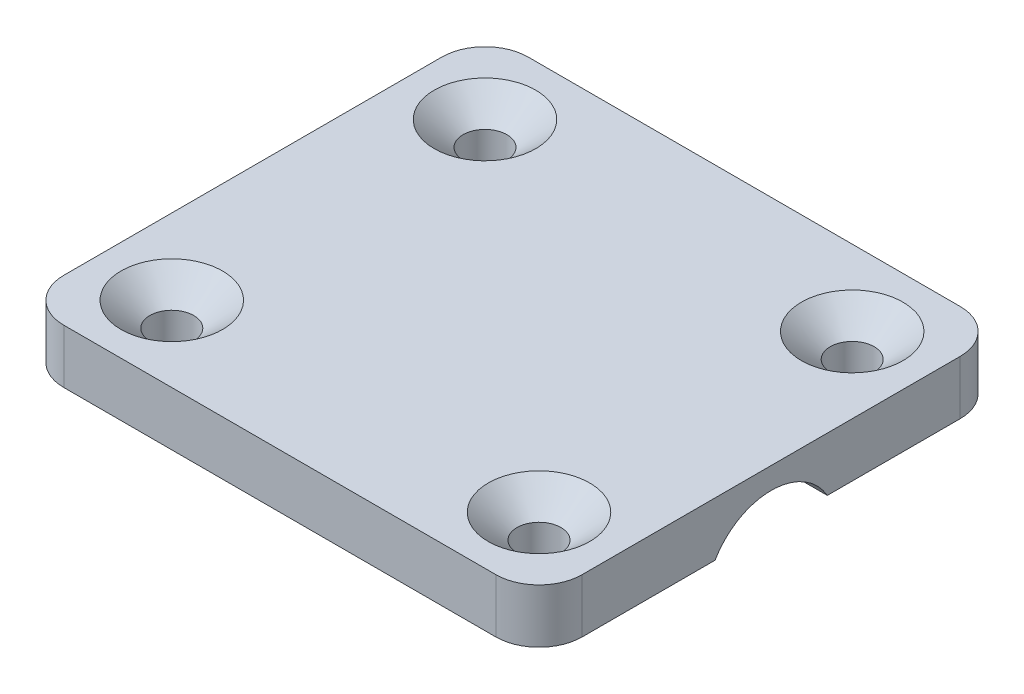
ISO-10303-21;
HEADER;
FILE_DESCRIPTION(('STEP AP214'),'2;1');
FILE_NAME('part.step','',(''),(''),'','','');
FILE_SCHEMA(('AUTOMOTIVE_DESIGN { 1 0 10303 214 1 1 1 1 }'));
ENDSEC;
DATA;
#1=APPLICATION_CONTEXT('core data for automotive mechanical design processes');
#2=APPLICATION_PROTOCOL_DEFINITION('international standard','automotive_design',2000,#1);
#3=PRODUCT_CONTEXT('',#1,'mechanical');
#4=PRODUCT('Part','Part','',(#3));
#5=PRODUCT_RELATED_PRODUCT_CATEGORY('part','',(#4));
#6=PRODUCT_DEFINITION_FORMATION('','',#4);
#7=PRODUCT_DEFINITION_CONTEXT('part definition',#1,'design');
#8=PRODUCT_DEFINITION('design','',#6,#7);
#9=PRODUCT_DEFINITION_SHAPE('','',#8);
#10=(LENGTH_UNIT() NAMED_UNIT(*) SI_UNIT(.MILLI.,.METRE.));
#11=(NAMED_UNIT(*) PLANE_ANGLE_UNIT() SI_UNIT($,.RADIAN.));
#12=(NAMED_UNIT(*) SI_UNIT($,.STERADIAN.) SOLID_ANGLE_UNIT());
#13=UNCERTAINTY_MEASURE_WITH_UNIT(LENGTH_MEASURE(1.E-05),#10,'distance_accuracy_value','');
#14=(GEOMETRIC_REPRESENTATION_CONTEXT(3) GLOBAL_UNCERTAINTY_ASSIGNED_CONTEXT((#13)) GLOBAL_UNIT_ASSIGNED_CONTEXT((#10,
#11,#12)) REPRESENTATION_CONTEXT('',''));
#15=CARTESIAN_POINT('',(0.,0.,0.));
#16=DIRECTION('',(0.,0.,1.));
#17=DIRECTION('',(1.,0.,0.));
#18=AXIS2_PLACEMENT_3D('',#15,#16,#17);
#19=CARTESIAN_POINT('',(0.,0.,0.));
#20=DIRECTION('',(0.,1.,0.));
#21=DIRECTION('',(0.,0.,1.));
#22=AXIS2_PLACEMENT_3D('',#19,#20,#21);
#23=PLANE('',#22);
#24=CARTESIAN_POINT('',(17.,0.,14.5));
#25=DIRECTION('',(0.,1.,0.));
#26=DIRECTION('',(0.,0.,1.));
#27=AXIS2_PLACEMENT_3D('',#24,#25,#26);
#28=CIRCLE('',#27,2.03199999999999);
#29=CARTESIAN_POINT('',(17.,0.,16.532));
#30=VERTEX_POINT('',#29);
#31=EDGE_CURVE('E180',#30,#30,#28,.T.);
#32=ORIENTED_EDGE('',*,*,#31,.T.);
#33=EDGE_LOOP('',(#32));
#34=FACE_BOUND('',#33,.T.);
#35=CARTESIAN_POINT('',(-17.,0.,14.5));
#36=DIRECTION('',(0.,1.,0.));
#37=DIRECTION('',(0.,0.,1.));
#38=AXIS2_PLACEMENT_3D('',#35,#36,#37);
#39=CIRCLE('',#38,2.03199999999999);
#40=CARTESIAN_POINT('',(-17.,0.,16.532));
#41=VERTEX_POINT('',#40);
#42=EDGE_CURVE('E190',#41,#41,#39,.T.);
#43=ORIENTED_EDGE('',*,*,#42,.T.);
#44=EDGE_LOOP('',(#43));
#45=FACE_BOUND('',#44,.T.);
#46=DIRECTION('',(0.,0.,1.));
#47=VECTOR('',#46,1.);
#48=CARTESIAN_POINT('',(-24.,0.,-21.5));
#49=LINE('',#48,#47);
#50=CARTESIAN_POINT('',(-24.,0.,5.19615242270664));
#51=VERTEX_POINT('',#50);
#52=CARTESIAN_POINT('',(-24.,0.,17.5));
#53=VERTEX_POINT('',#52);
#54=EDGE_CURVE('E121',#51,#53,#49,.T.);
#55=ORIENTED_EDGE('',*,*,#54,.F.);
#56=DIRECTION('',(1.,0.,0.));
#57=VECTOR('',#56,1.);
#58=CARTESIAN_POINT('',(-31.,0.,5.19615242270664));
#59=LINE('',#58,#57);
#60=CARTESIAN_POINT('',(24.,0.,5.19615242270663));
#61=VERTEX_POINT('',#60);
#62=EDGE_CURVE('E11',#51,#61,#59,.T.);
#63=ORIENTED_EDGE('',*,*,#62,.T.);
#64=DIRECTION('',(0.,0.,-1.));
#65=VECTOR('',#64,1.);
#66=CARTESIAN_POINT('',(24.,0.,-21.5));
#67=LINE('',#66,#65);
#68=CARTESIAN_POINT('',(24.,0.,17.5));
#69=VERTEX_POINT('',#68);
#70=EDGE_CURVE('E119',#69,#61,#67,.T.);
#71=ORIENTED_EDGE('',*,*,#70,.F.);
#72=CARTESIAN_POINT('',(20.,0.,17.5));
#73=DIRECTION('',(0.,1.,0.));
#74=DIRECTION('',(0.,0.,1.));
#75=AXIS2_PLACEMENT_3D('',#72,#73,#74);
#76=CIRCLE('',#75,4.);
#77=CARTESIAN_POINT('',(20.,0.,21.5));
#78=VERTEX_POINT('',#77);
#79=EDGE_CURVE('E148',#69,#78,#76,.F.);
#80=ORIENTED_EDGE('',*,*,#79,.T.);
#81=DIRECTION('',(1.,0.,0.));
#82=VECTOR('',#81,1.);
#83=CARTESIAN_POINT('',(-24.,0.,21.5));
#84=LINE('',#83,#82);
#85=CARTESIAN_POINT('',(-20.,0.,21.5));
#86=VERTEX_POINT('',#85);
#87=EDGE_CURVE('E139',#86,#78,#84,.T.);
#88=ORIENTED_EDGE('',*,*,#87,.F.);
#89=CARTESIAN_POINT('',(-20.,0.,17.5));
#90=DIRECTION('',(0.,1.,0.));
#91=DIRECTION('',(0.,0.,1.));
#92=AXIS2_PLACEMENT_3D('',#89,#90,#91);
#93=CIRCLE('',#92,4.);
#94=EDGE_CURVE('E155',#86,#53,#93,.F.);
#95=ORIENTED_EDGE('',*,*,#94,.T.);
#96=EDGE_LOOP('',(#55,#63,#71,#80,#88,#95));
#97=FACE_BOUND('',#96,.T.);
#98=ADVANCED_FACE('F33',(#34,#45,#97),#23,.F.);
#99=CARTESIAN_POINT('',(24.,5.,-21.5));
#100=DIRECTION('',(-1.,0.,0.));
#101=DIRECTION('',(0.,0.,1.));
#102=AXIS2_PLACEMENT_3D('',#99,#100,#101);
#103=PLANE('',#102);
#104=ORIENTED_EDGE('',*,*,#70,.T.);
#105=CARTESIAN_POINT('',(24.,-3.,0.));
#106=DIRECTION('',(1.,0.,0.));
#107=DIRECTION('',(0.,0.,1.));
#108=AXIS2_PLACEMENT_3D('',#105,#106,#107);
#109=CIRCLE('',#108,6.);
#110=CARTESIAN_POINT('',(24.,0.,-5.19615242270663));
#111=VERTEX_POINT('',#110);
#112=EDGE_CURVE('E110',#111,#61,#109,.T.);
#113=ORIENTED_EDGE('',*,*,#112,.F.);
#114=CARTESIAN_POINT('',(24.,0.,-17.5));
#115=VERTEX_POINT('',#114);
#116=EDGE_CURVE('E128',#111,#115,#67,.T.);
#117=ORIENTED_EDGE('',*,*,#116,.T.);
#118=DIRECTION('',(0.,-1.,0.));
#119=VECTOR('',#118,1.);
#120=CARTESIAN_POINT('',(24.,5.,-17.5));
#121=LINE('',#120,#119);
#122=CARTESIAN_POINT('',(24.,5.,-17.5));
#123=VERTEX_POINT('',#122);
#124=EDGE_CURVE('E175',#115,#123,#121,.F.);
#125=ORIENTED_EDGE('',*,*,#124,.T.);
#126=DIRECTION('',(0.,0.,-1.));
#127=VECTOR('',#126,1.);
#128=CARTESIAN_POINT('',(24.,5.,-21.5));
#129=LINE('',#128,#127);
#130=CARTESIAN_POINT('',(24.,5.,17.5));
#131=VERTEX_POINT('',#130);
#132=EDGE_CURVE('E142',#131,#123,#129,.T.);
#133=ORIENTED_EDGE('',*,*,#132,.F.);
#134=DIRECTION('',(0.,-1.,0.));
#135=VECTOR('',#134,1.);
#136=CARTESIAN_POINT('',(24.,5.,17.5));
#137=LINE('',#136,#135);
#138=EDGE_CURVE('E126',#131,#69,#137,.T.);
#139=ORIENTED_EDGE('',*,*,#138,.T.);
#140=EDGE_LOOP('',(#104,#113,#117,#125,#133,#139));
#141=FACE_BOUND('',#140,.T.);
#142=ADVANCED_FACE('F123',(#141),#103,.F.);
#143=CARTESIAN_POINT('',(-24.,5.,-21.5));
#144=DIRECTION('',(0.,0.,1.));
#145=DIRECTION('',(1.,0.,0.));
#146=AXIS2_PLACEMENT_3D('',#143,#144,#145);
#147=PLANE('',#146);
#148=DIRECTION('',(-1.,0.,0.));
#149=VECTOR('',#148,1.);
#150=CARTESIAN_POINT('',(-24.,0.,-21.5));
#151=LINE('',#150,#149);
#152=CARTESIAN_POINT('',(20.,0.,-21.5));
#153=VERTEX_POINT('',#152);
#154=CARTESIAN_POINT('',(-20.,0.,-21.5));
#155=VERTEX_POINT('',#154);
#156=EDGE_CURVE('E127',#153,#155,#151,.T.);
#157=ORIENTED_EDGE('',*,*,#156,.T.);
#158=DIRECTION('',(0.,-1.,0.));
#159=VECTOR('',#158,1.);
#160=CARTESIAN_POINT('',(-20.,5.,-21.5));
#161=LINE('',#160,#159);
#162=CARTESIAN_POINT('',(-20.,5.,-21.5));
#163=VERTEX_POINT('',#162);
#164=EDGE_CURVE('E56',#155,#163,#161,.F.);
#165=ORIENTED_EDGE('',*,*,#164,.T.);
#166=DIRECTION('',(-1.,0.,0.));
#167=VECTOR('',#166,1.);
#168=CARTESIAN_POINT('',(-24.,5.,-21.5));
#169=LINE('',#168,#167);
#170=CARTESIAN_POINT('',(20.,5.,-21.5));
#171=VERTEX_POINT('',#170);
#172=EDGE_CURVE('E209',#171,#163,#169,.T.);
#173=ORIENTED_EDGE('',*,*,#172,.F.);
#174=DIRECTION('',(0.,-1.,0.));
#175=VECTOR('',#174,1.);
#176=CARTESIAN_POINT('',(20.,5.,-21.5));
#177=LINE('',#176,#175);
#178=EDGE_CURVE('E170',#171,#153,#177,.T.);
#179=ORIENTED_EDGE('',*,*,#178,.T.);
#180=EDGE_LOOP('',(#157,#165,#173,#179));
#181=FACE_BOUND('',#180,.T.);
#182=ADVANCED_FACE('F207',(#181),#147,.F.);
#183=CARTESIAN_POINT('',(-24.,5.,-21.5));
#184=DIRECTION('',(1.,0.,0.));
#185=DIRECTION('',(0.,0.,-1.));
#186=AXIS2_PLACEMENT_3D('',#183,#184,#185);
#187=PLANE('',#186);
#188=CARTESIAN_POINT('',(-24.,0.,-17.5));
#189=VERTEX_POINT('',#188);
#190=CARTESIAN_POINT('',(-24.,0.,-5.19615242270663));
#191=VERTEX_POINT('',#190);
#192=EDGE_CURVE('E136',#189,#191,#49,.T.);
#193=ORIENTED_EDGE('',*,*,#192,.T.);
#194=CARTESIAN_POINT('',(-24.,-3.,0.));
#195=DIRECTION('',(1.,0.,0.));
#196=DIRECTION('',(0.,0.,-1.));
#197=AXIS2_PLACEMENT_3D('',#194,#195,#196);
#198=CIRCLE('',#197,6.);
#199=EDGE_CURVE('E48',#191,#51,#198,.T.);
#200=ORIENTED_EDGE('',*,*,#199,.T.);
#201=ORIENTED_EDGE('',*,*,#54,.T.);
#202=DIRECTION('',(0.,-1.,0.));
#203=VECTOR('',#202,1.);
#204=CARTESIAN_POINT('',(-24.,5.,17.5));
#205=LINE('',#204,#203);
#206=CARTESIAN_POINT('',(-24.,5.,17.5));
#207=VERTEX_POINT('',#206);
#208=EDGE_CURVE('E160',#53,#207,#205,.F.);
#209=ORIENTED_EDGE('',*,*,#208,.T.);
#210=DIRECTION('',(0.,0.,1.));
#211=VECTOR('',#210,1.);
#212=CARTESIAN_POINT('',(-24.,5.,-21.5));
#213=LINE('',#212,#211);
#214=CARTESIAN_POINT('',(-24.,5.,-17.5));
#215=VERTEX_POINT('',#214);
#216=EDGE_CURVE('E202',#215,#207,#213,.T.);
#217=ORIENTED_EDGE('',*,*,#216,.F.);
#218=DIRECTION('',(0.,-1.,0.));
#219=VECTOR('',#218,1.);
#220=CARTESIAN_POINT('',(-24.,5.,-17.5));
#221=LINE('',#220,#219);
#222=EDGE_CURVE('E157',#215,#189,#221,.T.);
#223=ORIENTED_EDGE('',*,*,#222,.T.);
#224=EDGE_LOOP('',(#193,#200,#201,#209,#217,#223));
#225=FACE_BOUND('',#224,.T.);
#226=ADVANCED_FACE('F198',(#225),#187,.F.);
#227=CARTESIAN_POINT('',(-24.,5.,21.5));
#228=DIRECTION('',(0.,0.,-1.));
#229=DIRECTION('',(-1.,0.,0.));
#230=AXIS2_PLACEMENT_3D('',#227,#228,#229);
#231=PLANE('',#230);
#232=DIRECTION('',(1.,0.,0.));
#233=VECTOR('',#232,1.);
#234=CARTESIAN_POINT('',(-24.,5.,21.5));
#235=LINE('',#234,#233);
#236=CARTESIAN_POINT('',(-20.,5.,21.5));
#237=VERTEX_POINT('',#236);
#238=CARTESIAN_POINT('',(20.,5.,21.5));
#239=VERTEX_POINT('',#238);
#240=EDGE_CURVE('E133',#237,#239,#235,.T.);
#241=ORIENTED_EDGE('',*,*,#240,.F.);
#242=DIRECTION('',(0.,-1.,0.));
#243=VECTOR('',#242,1.);
#244=CARTESIAN_POINT('',(-20.,5.,21.5));
#245=LINE('',#244,#243);
#246=EDGE_CURVE('E145',#237,#86,#245,.T.);
#247=ORIENTED_EDGE('',*,*,#246,.T.);
#248=ORIENTED_EDGE('',*,*,#87,.T.);
#249=DIRECTION('',(0.,-1.,0.));
#250=VECTOR('',#249,1.);
#251=CARTESIAN_POINT('',(20.,5.,21.5));
#252=LINE('',#251,#250);
#253=EDGE_CURVE('E143',#78,#239,#252,.F.);
#254=ORIENTED_EDGE('',*,*,#253,.T.);
#255=EDGE_LOOP('',(#241,#247,#248,#254));
#256=FACE_BOUND('',#255,.T.);
#257=ADVANCED_FACE('F230',(#256),#231,.F.);
#258=CARTESIAN_POINT('',(0.,5.,0.));
#259=DIRECTION('',(0.,1.,0.));
#260=DIRECTION('',(0.,0.,1.));
#261=AXIS2_PLACEMENT_3D('',#258,#259,#260);
#262=PLANE('',#261);
#263=CARTESIAN_POINT('',(-17.,5.,14.5));
#264=DIRECTION('',(0.,1.,0.));
#265=DIRECTION('',(0.,0.,1.));
#266=AXIS2_PLACEMENT_3D('',#263,#264,#265);
#267=CIRCLE('',#266,4.699);
#268=CARTESIAN_POINT('',(-17.,5.,19.199));
#269=VERTEX_POINT('',#268);
#270=EDGE_CURVE('E430',#269,#269,#267,.T.);
#271=ORIENTED_EDGE('',*,*,#270,.F.);
#272=EDGE_LOOP('',(#271));
#273=FACE_BOUND('',#272,.T.);
#274=CARTESIAN_POINT('',(-17.,5.,-14.5));
#275=DIRECTION('',(0.,1.,0.));
#276=DIRECTION('',(0.,0.,1.));
#277=AXIS2_PLACEMENT_3D('',#274,#275,#276);
#278=CIRCLE('',#277,4.699);
#279=CARTESIAN_POINT('',(-17.,5.,-9.801));
#280=VERTEX_POINT('',#279);
#281=EDGE_CURVE('E192',#280,#280,#278,.T.);
#282=ORIENTED_EDGE('',*,*,#281,.F.);
#283=EDGE_LOOP('',(#282));
#284=FACE_BOUND('',#283,.T.);
#285=CARTESIAN_POINT('',(17.,5.,14.5));
#286=DIRECTION('',(0.,1.,0.));
#287=DIRECTION('',(0.,0.,1.));
#288=AXIS2_PLACEMENT_3D('',#285,#286,#287);
#289=CIRCLE('',#288,4.699);
#290=CARTESIAN_POINT('',(17.,5.,19.199));
#291=VERTEX_POINT('',#290);
#292=EDGE_CURVE('E188',#291,#291,#289,.T.);
#293=ORIENTED_EDGE('',*,*,#292,.F.);
#294=EDGE_LOOP('',(#293));
#295=FACE_BOUND('',#294,.T.);
#296=CARTESIAN_POINT('',(17.,5.,-14.5));
#297=DIRECTION('',(0.,1.,0.));
#298=DIRECTION('',(0.,0.,1.));
#299=AXIS2_PLACEMENT_3D('',#296,#297,#298);
#300=CIRCLE('',#299,4.699);
#301=CARTESIAN_POINT('',(17.,5.,-9.801));
#302=VERTEX_POINT('',#301);
#303=EDGE_CURVE('E183',#302,#302,#300,.T.);
#304=ORIENTED_EDGE('',*,*,#303,.F.);
#305=EDGE_LOOP('',(#304));
#306=FACE_BOUND('',#305,.T.);
#307=ORIENTED_EDGE('',*,*,#216,.T.);
#308=CARTESIAN_POINT('',(-20.,5.,17.5));
#309=DIRECTION('',(0.,1.,0.));
#310=DIRECTION('',(0.,0.,1.));
#311=AXIS2_PLACEMENT_3D('',#308,#309,#310);
#312=CIRCLE('',#311,4.);
#313=EDGE_CURVE('E168',#207,#237,#312,.T.);
#314=ORIENTED_EDGE('',*,*,#313,.T.);
#315=ORIENTED_EDGE('',*,*,#240,.T.);
#316=CARTESIAN_POINT('',(20.,5.,17.5));
#317=DIRECTION('',(0.,1.,0.));
#318=DIRECTION('',(0.,0.,1.));
#319=AXIS2_PLACEMENT_3D('',#316,#317,#318);
#320=CIRCLE('',#319,4.);
#321=EDGE_CURVE('E162',#239,#131,#320,.T.);
#322=ORIENTED_EDGE('',*,*,#321,.T.);
#323=ORIENTED_EDGE('',*,*,#132,.T.);
#324=CARTESIAN_POINT('',(20.,5.,-17.5));
#325=DIRECTION('',(0.,1.,0.));
#326=DIRECTION('',(0.,0.,1.));
#327=AXIS2_PLACEMENT_3D('',#324,#325,#326);
#328=CIRCLE('',#327,4.);
#329=EDGE_CURVE('E164',#123,#171,#328,.T.);
#330=ORIENTED_EDGE('',*,*,#329,.T.);
#331=ORIENTED_EDGE('',*,*,#172,.T.);
#332=CARTESIAN_POINT('',(-20.,5.,-17.5));
#333=DIRECTION('',(0.,1.,0.));
#334=DIRECTION('',(0.,0.,1.));
#335=AXIS2_PLACEMENT_3D('',#332,#333,#334);
#336=CIRCLE('',#335,4.);
#337=EDGE_CURVE('E166',#163,#215,#336,.T.);
#338=ORIENTED_EDGE('',*,*,#337,.T.);
#339=EDGE_LOOP('',(#307,#314,#315,#322,#323,#330,#331,#338));
#340=FACE_BOUND('',#339,.T.);
#341=ADVANCED_FACE('F216',(#273,#284,#295,#306,#340),#262,.T.);
#342=CARTESIAN_POINT('',(-17.,0.,-14.5));
#343=DIRECTION('',(0.,1.,0.));
#344=DIRECTION('',(0.,0.,1.));
#345=AXIS2_PLACEMENT_3D('',#342,#343,#344);
#346=CIRCLE('',#345,2.03199999999999);
#347=CARTESIAN_POINT('',(-17.,0.,-12.468));
#348=VERTEX_POINT('',#347);
#349=EDGE_CURVE('E185',#348,#348,#346,.T.);
#350=ORIENTED_EDGE('',*,*,#349,.T.);
#351=EDGE_LOOP('',(#350));
#352=FACE_BOUND('',#351,.T.);
#353=CARTESIAN_POINT('',(17.,0.,-14.5));
#354=DIRECTION('',(0.,1.,0.));
#355=DIRECTION('',(0.,0.,1.));
#356=AXIS2_PLACEMENT_3D('',#353,#354,#355);
#357=CIRCLE('',#356,2.03199999999999);
#358=CARTESIAN_POINT('',(17.,0.,-12.468));
#359=VERTEX_POINT('',#358);
#360=EDGE_CURVE('E131',#359,#359,#357,.T.);
#361=ORIENTED_EDGE('',*,*,#360,.T.);
#362=EDGE_LOOP('',(#361));
#363=FACE_BOUND('',#362,.T.);
#364=ORIENTED_EDGE('',*,*,#116,.F.);
#365=DIRECTION('',(1.,0.,0.));
#366=VECTOR('',#365,1.);
#367=CARTESIAN_POINT('',(-31.,0.,-5.19615242270663));
#368=LINE('',#367,#366);
#369=EDGE_CURVE('E41',#111,#191,#368,.F.);
#370=ORIENTED_EDGE('',*,*,#369,.T.);
#371=ORIENTED_EDGE('',*,*,#192,.F.);
#372=CARTESIAN_POINT('',(-20.,0.,-17.5));
#373=DIRECTION('',(0.,1.,0.));
#374=DIRECTION('',(0.,0.,1.));
#375=AXIS2_PLACEMENT_3D('',#372,#373,#374);
#376=CIRCLE('',#375,4.);
#377=EDGE_CURVE('E153',#189,#155,#376,.F.);
#378=ORIENTED_EDGE('',*,*,#377,.T.);
#379=ORIENTED_EDGE('',*,*,#156,.F.);
#380=CARTESIAN_POINT('',(20.,0.,-17.5));
#381=DIRECTION('',(0.,1.,0.));
#382=DIRECTION('',(0.,0.,1.));
#383=AXIS2_PLACEMENT_3D('',#380,#381,#382);
#384=CIRCLE('',#383,4.);
#385=EDGE_CURVE('E150',#153,#115,#384,.F.);
#386=ORIENTED_EDGE('',*,*,#385,.T.);
#387=EDGE_LOOP('',(#364,#370,#371,#378,#379,#386));
#388=FACE_BOUND('',#387,.T.);
#389=ADVANCED_FACE('F196',(#352,#363,#388),#23,.F.);
#390=CARTESIAN_POINT('',(-20.,5.,17.5));
#391=DIRECTION('',(0.,-1.,0.));
#392=DIRECTION('',(0.,0.,-1.));
#393=AXIS2_PLACEMENT_3D('',#390,#391,#392);
#394=CYLINDRICAL_SURFACE('',#393,4.);
#395=ORIENTED_EDGE('',*,*,#313,.F.);
#396=ORIENTED_EDGE('',*,*,#208,.F.);
#397=ORIENTED_EDGE('',*,*,#94,.F.);
#398=ORIENTED_EDGE('',*,*,#246,.F.);
#399=EDGE_LOOP('',(#395,#396,#397,#398));
#400=FACE_BOUND('',#399,.T.);
#401=ADVANCED_FACE('F232',(#400),#394,.T.);
#402=CARTESIAN_POINT('',(-20.,5.,-17.5));
#403=DIRECTION('',(0.,-1.,0.));
#404=DIRECTION('',(0.,0.,-1.));
#405=AXIS2_PLACEMENT_3D('',#402,#403,#404);
#406=CYLINDRICAL_SURFACE('',#405,4.);
#407=ORIENTED_EDGE('',*,*,#337,.F.);
#408=ORIENTED_EDGE('',*,*,#164,.F.);
#409=ORIENTED_EDGE('',*,*,#377,.F.);
#410=ORIENTED_EDGE('',*,*,#222,.F.);
#411=EDGE_LOOP('',(#407,#408,#409,#410));
#412=FACE_BOUND('',#411,.T.);
#413=ADVANCED_FACE('F205',(#412),#406,.T.);
#414=CARTESIAN_POINT('',(20.,5.,-17.5));
#415=DIRECTION('',(0.,-1.,0.));
#416=DIRECTION('',(0.,0.,-1.));
#417=AXIS2_PLACEMENT_3D('',#414,#415,#416);
#418=CYLINDRICAL_SURFACE('',#417,4.);
#419=ORIENTED_EDGE('',*,*,#329,.F.);
#420=ORIENTED_EDGE('',*,*,#124,.F.);
#421=ORIENTED_EDGE('',*,*,#385,.F.);
#422=ORIENTED_EDGE('',*,*,#178,.F.);
#423=EDGE_LOOP('',(#419,#420,#421,#422));
#424=FACE_BOUND('',#423,.T.);
#425=ADVANCED_FACE('F212',(#424),#418,.T.);
#426=CARTESIAN_POINT('',(20.,5.,17.5));
#427=DIRECTION('',(0.,-1.,0.));
#428=DIRECTION('',(0.,0.,-1.));
#429=AXIS2_PLACEMENT_3D('',#426,#427,#428);
#430=CYLINDRICAL_SURFACE('',#429,4.);
#431=ORIENTED_EDGE('',*,*,#321,.F.);
#432=ORIENTED_EDGE('',*,*,#253,.F.);
#433=ORIENTED_EDGE('',*,*,#79,.F.);
#434=ORIENTED_EDGE('',*,*,#138,.F.);
#435=EDGE_LOOP('',(#431,#432,#433,#434));
#436=FACE_BOUND('',#435,.T.);
#437=ADVANCED_FACE('F35',(#436),#430,.T.);
#438=CARTESIAN_POINT('',(17.,5.,-14.5));
#439=DIRECTION('',(0.,1.,0.));
#440=DIRECTION('',(0.,0.,1.));
#441=AXIS2_PLACEMENT_3D('',#438,#439,#440);
#442=CYLINDRICAL_SURFACE('',#441,2.03199999999999);
#443=CARTESIAN_POINT('',(17.,2.7621212836502,-14.5));
#444=DIRECTION('',(0.,1.,0.));
#445=DIRECTION('',(0.,0.,1.));
#446=AXIS2_PLACEMENT_3D('',#443,#444,#445);
#447=CIRCLE('',#446,2.032);
#448=CARTESIAN_POINT('',(17.,2.7621212836502,-12.468));
#449=VERTEX_POINT('',#448);
#450=EDGE_CURVE('E179',#449,#449,#447,.T.);
#451=ORIENTED_EDGE('',*,*,#450,.T.);
#452=EDGE_LOOP('',(#451));
#453=FACE_BOUND('',#452,.T.);
#454=ORIENTED_EDGE('',*,*,#360,.F.);
#455=EDGE_LOOP('',(#454));
#456=FACE_BOUND('',#455,.T.);
#457=ADVANCED_FACE('F347',(#453,#456),#442,.F.);
#458=CARTESIAN_POINT('',(17.,5.,-14.5));
#459=DIRECTION('',(0.,1.,0.));
#460=DIRECTION('',(0.,0.,1.));
#461=AXIS2_PLACEMENT_3D('',#458,#459,#460);
#462=CONICAL_SURFACE('',#461,4.699,0.872664625997166);
#463=ORIENTED_EDGE('',*,*,#450,.F.);
#464=EDGE_LOOP('',(#463));
#465=FACE_BOUND('',#464,.T.);
#466=ORIENTED_EDGE('',*,*,#303,.T.);
#467=EDGE_LOOP('',(#466));
#468=FACE_BOUND('',#467,.T.);
#469=ADVANCED_FACE('F339',(#465,#468),#462,.F.);
#470=CARTESIAN_POINT('',(17.,5.,14.5));
#471=DIRECTION('',(0.,1.,0.));
#472=DIRECTION('',(0.,0.,1.));
#473=AXIS2_PLACEMENT_3D('',#470,#471,#472);
#474=CYLINDRICAL_SURFACE('',#473,2.03199999999999);
#475=CARTESIAN_POINT('',(17.,2.7621212836502,14.5));
#476=DIRECTION('',(0.,1.,0.));
#477=DIRECTION('',(0.,0.,1.));
#478=AXIS2_PLACEMENT_3D('',#475,#476,#477);
#479=CIRCLE('',#478,2.032);
#480=CARTESIAN_POINT('',(17.,2.7621212836502,16.532));
#481=VERTEX_POINT('',#480);
#482=EDGE_CURVE('E184',#481,#481,#479,.T.);
#483=ORIENTED_EDGE('',*,*,#482,.T.);
#484=EDGE_LOOP('',(#483));
#485=FACE_BOUND('',#484,.T.);
#486=ORIENTED_EDGE('',*,*,#31,.F.);
#487=EDGE_LOOP('',(#486));
#488=FACE_BOUND('',#487,.T.);
#489=ADVANCED_FACE('F331',(#485,#488),#474,.F.);
#490=CARTESIAN_POINT('',(17.,5.,14.5));
#491=DIRECTION('',(0.,1.,0.));
#492=DIRECTION('',(0.,0.,1.));
#493=AXIS2_PLACEMENT_3D('',#490,#491,#492);
#494=CONICAL_SURFACE('',#493,4.699,0.872664625997166);
#495=ORIENTED_EDGE('',*,*,#482,.F.);
#496=EDGE_LOOP('',(#495));
#497=FACE_BOUND('',#496,.T.);
#498=ORIENTED_EDGE('',*,*,#292,.T.);
#499=EDGE_LOOP('',(#498));
#500=FACE_BOUND('',#499,.T.);
#501=ADVANCED_FACE('F324',(#497,#500),#494,.F.);
#502=CARTESIAN_POINT('',(-17.,5.,-14.5));
#503=DIRECTION('',(0.,1.,0.));
#504=DIRECTION('',(0.,0.,1.));
#505=AXIS2_PLACEMENT_3D('',#502,#503,#504);
#506=CYLINDRICAL_SURFACE('',#505,2.03199999999999);
#507=CARTESIAN_POINT('',(-17.,2.7621212836502,-14.5));
#508=DIRECTION('',(0.,1.,0.));
#509=DIRECTION('',(0.,0.,1.));
#510=AXIS2_PLACEMENT_3D('',#507,#508,#509);
#511=CIRCLE('',#510,2.032);
#512=CARTESIAN_POINT('',(-17.,2.7621212836502,-12.468));
#513=VERTEX_POINT('',#512);
#514=EDGE_CURVE('E189',#513,#513,#511,.T.);
#515=ORIENTED_EDGE('',*,*,#514,.T.);
#516=EDGE_LOOP('',(#515));
#517=FACE_BOUND('',#516,.T.);
#518=ORIENTED_EDGE('',*,*,#349,.F.);
#519=EDGE_LOOP('',(#518));
#520=FACE_BOUND('',#519,.T.);
#521=ADVANCED_FACE('F317',(#517,#520),#506,.F.);
#522=CARTESIAN_POINT('',(-17.,5.,-14.5));
#523=DIRECTION('',(0.,1.,0.));
#524=DIRECTION('',(0.,0.,1.));
#525=AXIS2_PLACEMENT_3D('',#522,#523,#524);
#526=CONICAL_SURFACE('',#525,4.699,0.872664625997166);
#527=ORIENTED_EDGE('',*,*,#514,.F.);
#528=EDGE_LOOP('',(#527));
#529=FACE_BOUND('',#528,.T.);
#530=ORIENTED_EDGE('',*,*,#281,.T.);
#531=EDGE_LOOP('',(#530));
#532=FACE_BOUND('',#531,.T.);
#533=ADVANCED_FACE('F309',(#529,#532),#526,.F.);
#534=CARTESIAN_POINT('',(-17.,5.,14.5));
#535=DIRECTION('',(0.,1.,0.));
#536=DIRECTION('',(0.,0.,1.));
#537=AXIS2_PLACEMENT_3D('',#534,#535,#536);
#538=CYLINDRICAL_SURFACE('',#537,2.03199999999999);
#539=CARTESIAN_POINT('',(-17.,2.7621212836502,14.5));
#540=DIRECTION('',(0.,1.,0.));
#541=DIRECTION('',(0.,0.,1.));
#542=AXIS2_PLACEMENT_3D('',#539,#540,#541);
#543=CIRCLE('',#542,2.032);
#544=CARTESIAN_POINT('',(-17.,2.7621212836502,16.532));
#545=VERTEX_POINT('',#544);
#546=EDGE_CURVE('E193',#545,#545,#543,.T.);
#547=ORIENTED_EDGE('',*,*,#546,.T.);
#548=EDGE_LOOP('',(#547));
#549=FACE_BOUND('',#548,.T.);
#550=ORIENTED_EDGE('',*,*,#42,.F.);
#551=EDGE_LOOP('',(#550));
#552=FACE_BOUND('',#551,.T.);
#553=ADVANCED_FACE('F301',(#549,#552),#538,.F.);
#554=CARTESIAN_POINT('',(-17.,5.,14.5));
#555=DIRECTION('',(0.,1.,0.));
#556=DIRECTION('',(0.,0.,1.));
#557=AXIS2_PLACEMENT_3D('',#554,#555,#556);
#558=CONICAL_SURFACE('',#557,4.699,0.872664625997166);
#559=ORIENTED_EDGE('',*,*,#546,.F.);
#560=EDGE_LOOP('',(#559));
#561=FACE_BOUND('',#560,.T.);
#562=ORIENTED_EDGE('',*,*,#270,.T.);
#563=EDGE_LOOP('',(#562));
#564=FACE_BOUND('',#563,.T.);
#565=ADVANCED_FACE('F291',(#561,#564),#558,.F.);
#566=CARTESIAN_POINT('',(-31.,-3.,0.));
#567=DIRECTION('',(1.,0.,0.));
#568=DIRECTION('',(0.,0.,-1.));
#569=AXIS2_PLACEMENT_3D('',#566,#567,#568);
#570=CYLINDRICAL_SURFACE('',#569,6.);
#571=ORIENTED_EDGE('',*,*,#369,.F.);
#572=ORIENTED_EDGE('',*,*,#112,.T.);
#573=ORIENTED_EDGE('',*,*,#62,.F.);
#574=ORIENTED_EDGE('',*,*,#199,.F.);
#575=EDGE_LOOP('',(#571,#572,#573,#574));
#576=FACE_BOUND('',#575,.T.);
#577=ADVANCED_FACE('F111',(#576),#570,.F.);
#578=CLOSED_SHELL('',(#98,#142,#182,#226,#257,#341,#389,#401,#413,#425,#437,#457,#469,#489,#501,
#521,#533,#553,#565,#577));
#579=MANIFOLD_SOLID_BREP('B2',#578);
#580=ADVANCED_BREP_SHAPE_REPRESENTATION('',(#18,#579),#14);
#581=SHAPE_DEFINITION_REPRESENTATION(#9,#580);
ENDSEC;
END-ISO-10303-21;
